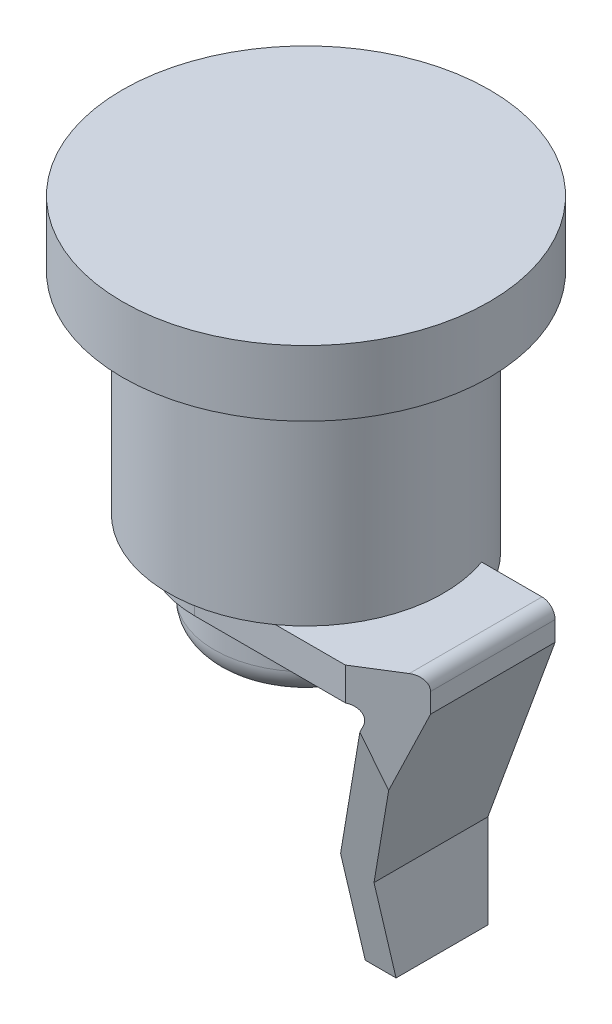
ISO-10303-21;
HEADER;
FILE_DESCRIPTION(('STEP AP214'),'2;1');
FILE_NAME('part.step','',(''),(''),'','','');
FILE_SCHEMA(('AUTOMOTIVE_DESIGN { 1 0 10303 214 1 1 1 1 }'));
ENDSEC;
DATA;
#1=APPLICATION_CONTEXT('core data for automotive mechanical design processes');
#2=APPLICATION_PROTOCOL_DEFINITION('international standard','automotive_design',2000,#1);
#3=PRODUCT_CONTEXT('',#1,'mechanical');
#4=PRODUCT('Part','Part','',(#3));
#5=PRODUCT_RELATED_PRODUCT_CATEGORY('part','',(#4));
#6=PRODUCT_DEFINITION_FORMATION('','',#4);
#7=PRODUCT_DEFINITION_CONTEXT('part definition',#1,'design');
#8=PRODUCT_DEFINITION('design','',#6,#7);
#9=PRODUCT_DEFINITION_SHAPE('','',#8);
#10=(LENGTH_UNIT() NAMED_UNIT(*) SI_UNIT(.MILLI.,.METRE.));
#11=(NAMED_UNIT(*) PLANE_ANGLE_UNIT() SI_UNIT($,.RADIAN.));
#12=(NAMED_UNIT(*) SI_UNIT($,.STERADIAN.) SOLID_ANGLE_UNIT());
#13=UNCERTAINTY_MEASURE_WITH_UNIT(LENGTH_MEASURE(1.E-05),#10,'distance_accuracy_value','');
#14=(GEOMETRIC_REPRESENTATION_CONTEXT(3) GLOBAL_UNCERTAINTY_ASSIGNED_CONTEXT((#13)) GLOBAL_UNIT_ASSIGNED_CONTEXT((#10,
#11,#12)) REPRESENTATION_CONTEXT('',''));
#15=CARTESIAN_POINT('',(0.,0.,0.));
#16=DIRECTION('',(0.,0.,1.));
#17=DIRECTION('',(1.,0.,0.));
#18=AXIS2_PLACEMENT_3D('',#15,#16,#17);
#19=CARTESIAN_POINT('',(8.02046629815024,-31.7403389534745,-31.018779346483));
#20=DIRECTION('',(-0.93969262078591,0.342020143325666,0.));
#21=DIRECTION('',(-0.342020143325666,-0.93969262078591,0.));
#22=AXIS2_PLACEMENT_3D('',#19,#20,#21);
#23=PLANE('',#22);
#24=DIRECTION('',(0.342020143325666,0.93969262078591,0.));
#25=VECTOR('',#24,1.);
#26=CARTESIAN_POINT('',(8.02046629815024,-31.7403389534745,-3.5));
#27=LINE('',#26,#25);
#28=CARTESIAN_POINT('',(8.02046629815024,-31.7403389534745,-3.5));
#29=VERTEX_POINT('',#28);
#30=CARTESIAN_POINT('',(12.351100182854,-19.8420201433257,-3.5));
#31=VERTEX_POINT('',#30);
#32=EDGE_CURVE('E312',#29,#31,#27,.T.);
#33=ORIENTED_EDGE('',*,*,#32,.F.);
#34=DIRECTION('',(0.,0.,1.));
#35=VECTOR('',#34,1.);
#36=CARTESIAN_POINT('',(8.02046629815024,-31.7403389534745,-31.018779346483));
#37=LINE('',#36,#35);
#38=CARTESIAN_POINT('',(8.02046629815024,-31.7403389534745,5.38320911863117));
#39=VERTEX_POINT('',#38);
#40=EDGE_CURVE('E179',#29,#39,#37,.T.);
#41=ORIENTED_EDGE('',*,*,#40,.T.);
#42=DIRECTION('',(0.333947437649457,0.917513044226624,0.215983616418828));
#43=VECTOR('',#42,1.);
#44=CARTESIAN_POINT('',(5.39489369568357,-38.9540403918904,3.6850955776427));
#45=LINE('',#44,#43);
#46=CARTESIAN_POINT('',(12.1812374264969,-20.3087142308233,8.07422660843945));
#47=VERTEX_POINT('',#46);
#48=EDGE_CURVE('E269',#39,#47,#45,.T.);
#49=ORIENTED_EDGE('',*,*,#48,.T.);
#50=DIRECTION('',(-0.334463926731101,-0.918932086315835,0.209039954206938));
#51=VECTOR('',#50,1.);
#52=CARTESIAN_POINT('',(10.9355217045529,-23.7312900479239,8.85279893465442));
#53=LINE('',#52,#51);
#54=CARTESIAN_POINT('',(12.351100182854,-19.8420201433257,7.96806238571625));
#55=VERTEX_POINT('',#54);
#56=EDGE_CURVE('E52',#55,#47,#53,.T.);
#57=ORIENTED_EDGE('',*,*,#56,.F.);
#58=DIRECTION('',(0.,0.,1.));
#59=VECTOR('',#58,1.);
#60=CARTESIAN_POINT('',(12.351100182854,-19.8420201433257,-8.5));
#61=LINE('',#60,#59);
#62=EDGE_CURVE('E232',#55,#31,#61,.F.);
#63=ORIENTED_EDGE('',*,*,#62,.T.);
#64=EDGE_LOOP('',(#33,#41,#49,#57,#63));
#65=FACE_BOUND('',#64,.T.);
#66=ADVANCED_FACE('F37',(#65),#23,.T.);
#67=CARTESIAN_POINT('',(0.,-18.5,0.));
#68=DIRECTION('',(0.,-1.,0.));
#69=DIRECTION('',(0.,0.,-1.));
#70=AXIS2_PLACEMENT_3D('',#67,#68,#69);
#71=PLANE('',#70);
#72=CARTESIAN_POINT('',(0.,-18.5,0.));
#73=DIRECTION('',(0.,-1.,0.));
#74=DIRECTION('',(0.,0.,-1.));
#75=AXIS2_PLACEMENT_3D('',#72,#73,#74);
#76=CIRCLE('',#75,7.);
#77=CARTESIAN_POINT('',(0.,-18.5,-7.));
#78=VERTEX_POINT('',#77);
#79=EDGE_CURVE('E205',#78,#78,#76,.T.);
#80=ORIENTED_EDGE('',*,*,#79,.F.);
#81=EDGE_LOOP('',(#80));
#82=FACE_BOUND('',#81,.T.);
#83=DIRECTION('',(-1.,0.,0.));
#84=VECTOR('',#83,1.);
#85=CARTESIAN_POINT('',(0.,-18.5,-3.5));
#86=LINE('',#85,#84);
#87=CARTESIAN_POINT('',(11.4114075620681,-18.5,-3.5));
#88=VERTEX_POINT('',#87);
#89=CARTESIAN_POINT('',(9.89949493661167,-18.5,-3.5));
#90=VERTEX_POINT('',#89);
#91=EDGE_CURVE('E308',#88,#90,#86,.T.);
#92=ORIENTED_EDGE('',*,*,#91,.F.);
#93=DIRECTION('',(0.,0.,1.));
#94=VECTOR('',#93,1.);
#95=CARTESIAN_POINT('',(11.4114075620681,-18.5,8.5));
#96=LINE('',#95,#94);
#97=CARTESIAN_POINT('',(11.4114075620681,-18.5,8.5));
#98=VERTEX_POINT('',#97);
#99=EDGE_CURVE('E60',#88,#98,#96,.T.);
#100=ORIENTED_EDGE('',*,*,#99,.T.);
#101=DIRECTION('',(1.,0.,0.));
#102=VECTOR('',#101,1.);
#103=CARTESIAN_POINT('',(0.,-18.5,8.5));
#104=LINE('',#103,#102);
#105=CARTESIAN_POINT('',(0.,-18.5,8.5));
#106=VERTEX_POINT('',#105);
#107=EDGE_CURVE('E194',#106,#98,#104,.T.);
#108=ORIENTED_EDGE('',*,*,#107,.F.);
#109=CARTESIAN_POINT('',(0.,-18.5,0.));
#110=DIRECTION('',(0.,-1.,0.));
#111=DIRECTION('',(0.,0.,-1.));
#112=AXIS2_PLACEMENT_3D('',#109,#110,#111);
#113=CIRCLE('',#112,8.5);
#114=CARTESIAN_POINT('',(0.,-18.5,-8.5));
#115=VERTEX_POINT('',#114);
#116=EDGE_CURVE('E202',#106,#115,#113,.T.);
#117=ORIENTED_EDGE('',*,*,#116,.T.);
#118=DIRECTION('',(1.,0.,0.));
#119=VECTOR('',#118,1.);
#120=CARTESIAN_POINT('',(0.,-18.5,-8.5));
#121=LINE('',#120,#119);
#122=CARTESIAN_POINT('',(6.16441400296898,-18.5,-8.5));
#123=VERTEX_POINT('',#122);
#124=EDGE_CURVE('E196',#115,#123,#121,.T.);
#125=ORIENTED_EDGE('',*,*,#124,.T.);
#126=CARTESIAN_POINT('',(0.,-18.5,0.));
#127=DIRECTION('',(0.,-1.,0.));
#128=DIRECTION('',(0.,0.,-1.));
#129=AXIS2_PLACEMENT_3D('',#126,#127,#128);
#130=CIRCLE('',#129,10.5);
#131=EDGE_CURVE('E306',#90,#123,#130,.F.);
#132=ORIENTED_EDGE('',*,*,#131,.F.);
#133=EDGE_LOOP('',(#92,#100,#108,#117,#125,#132));
#134=FACE_BOUND('',#133,.T.);
#135=ADVANCED_FACE('F316',(#82,#134),#71,.T.);
#136=CARTESIAN_POINT('',(-13.800441081207,-2.86718192677043,12.179983193176));
#137=DIRECTION('',(0.,-0.229138042386361,0.973393937484381));
#138=DIRECTION('',(0.,-0.973393937484381,-0.229138042386361));
#139=AXIS2_PLACEMENT_3D('',#136,#137,#138);
#140=PLANE('',#139);
#141=DIRECTION('',(0.344216744782319,-0.913910041579759,-0.215135465488949));
#142=VECTOR('',#141,1.);
#143=CARTESIAN_POINT('',(3.31193737381652,3.2396531940517,13.6175391413647));
#144=LINE('',#143,#142);
#145=CARTESIAN_POINT('',(11.5,-18.5,8.5));
#146=VERTEX_POINT('',#145);
#147=CARTESIAN_POINT('',(11.501532765285,-18.5040695567736,8.4990420216969));
#148=VERTEX_POINT('',#147);
#149=EDGE_CURVE('E45',#146,#148,#144,.T.);
#150=ORIENTED_EDGE('',*,*,#149,.F.);
#151=DIRECTION('',(1.,0.,0.));
#152=VECTOR('',#151,1.);
#153=CARTESIAN_POINT('',(-13.800441081207,-18.5,8.5));
#154=LINE('',#153,#152);
#155=EDGE_CURVE('E169',#98,#146,#154,.T.);
#156=ORIENTED_EDGE('',*,*,#155,.F.);
#157=CARTESIAN_POINT('',(11.4114075620681,-19.5,8.26459886017111));
#158=DIRECTION('',(0.,-0.229138042386361,0.973393937484381));
#159=DIRECTION('',(0.,-0.973393937484381,-0.229138042386361));
#160=AXIS2_PLACEMENT_3D('',#157,#158,#159);
#161=ELLIPSE('',#160,1.02733329384029,1.);
#162=EDGE_CURVE('E241',#98,#148,#161,.F.);
#163=ORIENTED_EDGE('',*,*,#162,.T.);
#164=EDGE_LOOP('',(#150,#156,#163));
#165=FACE_BOUND('',#164,.T.);
#166=ADVANCED_FACE('F261',(#165),#140,.T.);
#167=CARTESIAN_POINT('',(0.,-16.,8.5));
#168=DIRECTION('',(0.,0.,-1.));
#169=DIRECTION('',(-1.,0.,0.));
#170=AXIS2_PLACEMENT_3D('',#167,#168,#169);
#171=PLANE('',#170);
#172=ORIENTED_EDGE('',*,*,#155,.T.);
#173=DIRECTION('',(0.,1.,0.));
#174=VECTOR('',#173,1.);
#175=CARTESIAN_POINT('',(11.5,-36.,8.5));
#176=LINE('',#175,#174);
#177=CARTESIAN_POINT('',(11.5,-16.,8.5));
#178=VERTEX_POINT('',#177);
#179=EDGE_CURVE('E250',#146,#178,#176,.T.);
#180=ORIENTED_EDGE('',*,*,#179,.T.);
#181=DIRECTION('',(1.,0.,0.));
#182=VECTOR('',#181,1.);
#183=CARTESIAN_POINT('',(0.,-16.,8.5));
#184=LINE('',#183,#182);
#185=CARTESIAN_POINT('',(6.16441400296898,-16.,8.5));
#186=VERTEX_POINT('',#185);
#187=EDGE_CURVE('E188',#186,#178,#184,.T.);
#188=ORIENTED_EDGE('',*,*,#187,.F.);
#189=CARTESIAN_POINT('',(0.,-16.,8.5));
#190=VERTEX_POINT('',#189);
#191=EDGE_CURVE('E184',#190,#186,#184,.T.);
#192=ORIENTED_EDGE('',*,*,#191,.F.);
#193=DIRECTION('',(0.,-1.,0.));
#194=VECTOR('',#193,1.);
#195=CARTESIAN_POINT('',(0.,-16.,8.5));
#196=LINE('',#195,#194);
#197=EDGE_CURVE('E191',#190,#106,#196,.T.);
#198=ORIENTED_EDGE('',*,*,#197,.T.);
#199=ORIENTED_EDGE('',*,*,#107,.T.);
#200=EDGE_LOOP('',(#172,#180,#188,#192,#198,#199));
#201=FACE_BOUND('',#200,.T.);
#202=ADVANCED_FACE('F336',(#201),#171,.F.);
#203=CARTESIAN_POINT('',(8.02046629815024,-31.7403389534745,-31.018779346483));
#204=DIRECTION('',(-1.,0.,0.));
#205=DIRECTION('',(0.,-1.,0.));
#206=AXIS2_PLACEMENT_3D('',#203,#204,#205);
#207=PLANE('',#206);
#208=DIRECTION('',(0.,1.,0.));
#209=VECTOR('',#208,1.);
#210=CARTESIAN_POINT('',(8.02046629815024,-31.7403389534745,-3.5));
#211=LINE('',#210,#209);
#212=CARTESIAN_POINT('',(8.02046629815024,-39.7403389534745,-3.5));
#213=VERTEX_POINT('',#212);
#214=EDGE_CURVE('E286',#213,#29,#211,.T.);
#215=ORIENTED_EDGE('',*,*,#214,.F.);
#216=DIRECTION('',(0.,0.,1.));
#217=VECTOR('',#216,1.);
#218=CARTESIAN_POINT('',(8.02046629815025,-39.7403389534745,-31.018779346483));
#219=LINE('',#218,#217);
#220=CARTESIAN_POINT('',(8.02046629815024,-39.7403389534745,3.5));
#221=VERTEX_POINT('',#220);
#222=EDGE_CURVE('E168',#213,#221,#219,.T.);
#223=ORIENTED_EDGE('',*,*,#222,.T.);
#224=DIRECTION('',(0.,-0.973393937484381,-0.229138042386361));
#225=VECTOR('',#224,1.);
#226=CARTESIAN_POINT('',(8.02046629815023,-2.86718192677043,12.179983193176));
#227=LINE('',#226,#225);
#228=EDGE_CURVE('E265',#39,#221,#227,.T.);
#229=ORIENTED_EDGE('',*,*,#228,.F.);
#230=ORIENTED_EDGE('',*,*,#40,.F.);
#231=EDGE_LOOP('',(#215,#223,#229,#230));
#232=FACE_BOUND('',#231,.T.);
#233=ADVANCED_FACE('F284',(#232),#207,.T.);
#234=CARTESIAN_POINT('',(8.02046629815025,-39.7403389534745,-31.018779346483));
#235=DIRECTION('',(0.,-1.,0.));
#236=DIRECTION('',(0.,0.,-1.));
#237=AXIS2_PLACEMENT_3D('',#234,#235,#236);
#238=PLANE('',#237);
#239=DIRECTION('',(0.,0.,1.));
#240=VECTOR('',#239,1.);
#241=CARTESIAN_POINT('',(10.369697850115,-39.7403389534745,-31.018779346483));
#242=LINE('',#241,#240);
#243=CARTESIAN_POINT('',(10.369697850115,-39.7403389534745,-3.5));
#244=VERTEX_POINT('',#243);
#245=CARTESIAN_POINT('',(10.369697850115,-39.7403389534745,3.5));
#246=VERTEX_POINT('',#245);
#247=EDGE_CURVE('E166',#244,#246,#242,.T.);
#248=ORIENTED_EDGE('',*,*,#247,.T.);
#249=DIRECTION('',(1.,0.,0.));
#250=VECTOR('',#249,1.);
#251=CARTESIAN_POINT('',(-13.800441081207,-39.7403389534745,3.5));
#252=LINE('',#251,#250);
#253=EDGE_CURVE('E263',#221,#246,#252,.T.);
#254=ORIENTED_EDGE('',*,*,#253,.F.);
#255=ORIENTED_EDGE('',*,*,#222,.F.);
#256=DIRECTION('',(1.,0.,0.));
#257=VECTOR('',#256,1.);
#258=CARTESIAN_POINT('',(-13.800441081207,-39.7403389534745,-3.5));
#259=LINE('',#258,#257);
#260=EDGE_CURVE('E153',#213,#244,#259,.T.);
#261=ORIENTED_EDGE('',*,*,#260,.T.);
#262=EDGE_LOOP('',(#248,#254,#255,#261));
#263=FACE_BOUND('',#262,.T.);
#264=ADVANCED_FACE('F164',(#263),#238,.T.);
#265=CARTESIAN_POINT('',(10.369697850115,-39.7403389534745,-31.018779346483));
#266=DIRECTION('',(1.,0.,0.));
#267=DIRECTION('',(0.,0.,-1.));
#268=AXIS2_PLACEMENT_3D('',#265,#266,#267);
#269=PLANE('',#268);
#270=ORIENTED_EDGE('',*,*,#247,.F.);
#271=DIRECTION('',(0.,-1.,0.));
#272=VECTOR('',#271,1.);
#273=CARTESIAN_POINT('',(10.369697850115,-39.7403389534745,-3.5));
#274=LINE('',#273,#272);
#275=CARTESIAN_POINT('',(10.369697850115,-32.5953893117886,-3.5));
#276=VERTEX_POINT('',#275);
#277=EDGE_CURVE('E149',#276,#244,#274,.T.);
#278=ORIENTED_EDGE('',*,*,#277,.F.);
#279=DIRECTION('',(0.,0.,1.));
#280=VECTOR('',#279,1.);
#281=CARTESIAN_POINT('',(10.369697850115,-32.5953893117886,-31.018779346483));
#282=LINE('',#281,#280);
#283=CARTESIAN_POINT('',(10.369697850115,-32.5953893117886,5.1819292896729));
#284=VERTEX_POINT('',#283);
#285=EDGE_CURVE('E175',#276,#284,#282,.T.);
#286=ORIENTED_EDGE('',*,*,#285,.T.);
#287=DIRECTION('',(0.,-0.973393937484381,-0.229138042386361));
#288=VECTOR('',#287,1.);
#289=CARTESIAN_POINT('',(10.369697850115,-47.4394620836643,1.68761763947029));
#290=LINE('',#289,#288);
#291=EDGE_CURVE('E174',#284,#246,#290,.T.);
#292=ORIENTED_EDGE('',*,*,#291,.T.);
#293=EDGE_LOOP('',(#270,#278,#286,#292));
#294=FACE_BOUND('',#293,.T.);
#295=ADVANCED_FACE('F172',(#294),#269,.T.);
#296=CARTESIAN_POINT('',(15.5,-18.5,-31.018779346483));
#297=DIRECTION('',(0.93969262078591,-0.342020143325666,0.));
#298=DIRECTION('',(0.342020143325666,0.93969262078591,0.));
#299=AXIS2_PLACEMENT_3D('',#296,#297,#298);
#300=PLANE('',#299);
#301=DIRECTION('',(0.334463926731101,0.918932086315835,-0.209039954206938));
#302=VECTOR('',#301,1.);
#303=CARTESIAN_POINT('',(18.0882169681983,-11.3889323232257,4.38236439487606));
#304=LINE('',#303,#302);
#305=CARTESIAN_POINT('',(13.5342192361663,-23.9009382602313,7.22861297739604));
#306=VERTEX_POINT('',#305);
#307=CARTESIAN_POINT('',(15.5,-18.5,6.));
#308=VERTEX_POINT('',#307);
#309=EDGE_CURVE('E278',#306,#308,#304,.T.);
#310=ORIENTED_EDGE('',*,*,#309,.F.);
#311=DIRECTION('',(-0.333947437649457,-0.917513044226624,-0.215983616418828));
#312=VECTOR('',#311,1.);
#313=CARTESIAN_POINT('',(12.6496220753301,-26.3313489849427,6.65649152254661));
#314=LINE('',#313,#312);
#315=EDGE_CURVE('E272',#306,#284,#314,.T.);
#316=ORIENTED_EDGE('',*,*,#315,.T.);
#317=ORIENTED_EDGE('',*,*,#285,.F.);
#318=DIRECTION('',(-0.342020143325666,-0.93969262078591,0.));
#319=VECTOR('',#318,1.);
#320=CARTESIAN_POINT('',(15.5,-18.5,-3.5));
#321=LINE('',#320,#319);
#322=CARTESIAN_POINT('',(15.5,-18.5,-3.5));
#323=VERTEX_POINT('',#322);
#324=EDGE_CURVE('E156',#323,#276,#321,.T.);
#325=ORIENTED_EDGE('',*,*,#324,.F.);
#326=DIRECTION('',(0.,0.,-1.));
#327=VECTOR('',#326,1.);
#328=CARTESIAN_POINT('',(15.5,-18.5,0.));
#329=LINE('',#328,#327);
#330=EDGE_CURVE('E177',#308,#323,#329,.T.);
#331=ORIENTED_EDGE('',*,*,#330,.F.);
#332=EDGE_LOOP('',(#310,#316,#317,#325,#331));
#333=FACE_BOUND('',#332,.T.);
#334=ADVANCED_FACE('F276',(#333),#300,.T.);
#335=CARTESIAN_POINT('',(11.4114075620681,-19.5,0.));
#336=DIRECTION('',(0.,0.,-1.));
#337=DIRECTION('',(-1.,0.,0.));
#338=AXIS2_PLACEMENT_3D('',#335,#336,#337);
#339=CYLINDRICAL_SURFACE('',#338,1.);
#340=ORIENTED_EDGE('',*,*,#62,.F.);
#341=CARTESIAN_POINT('',(11.4114075620681,-19.5,8.55537027370743));
#342=DIRECTION('',(-0.52999894000318,0.,-0.847998304005088));
#343=DIRECTION('',(0.847998304005088,0.,-0.52999894000318));
#344=AXIS2_PLACEMENT_3D('',#341,#342,#343);
#345=ELLIPSE('',#344,1.17924764150708,1.);
#346=EDGE_CURVE('E248',#55,#148,#345,.F.);
#347=ORIENTED_EDGE('',*,*,#346,.T.);
#348=ORIENTED_EDGE('',*,*,#162,.F.);
#349=ORIENTED_EDGE('',*,*,#99,.F.);
#350=CARTESIAN_POINT('',(11.4114075620681,-19.5,-3.5));
#351=DIRECTION('',(0.,0.,1.));
#352=DIRECTION('',(1.,0.,0.));
#353=AXIS2_PLACEMENT_3D('',#350,#351,#352);
#354=CIRCLE('',#353,1.);
#355=EDGE_CURVE('E310',#88,#31,#354,.F.);
#356=ORIENTED_EDGE('',*,*,#355,.T.);
#357=EDGE_LOOP('',(#340,#347,#348,#349,#356));
#358=FACE_BOUND('',#357,.T.);
#359=ADVANCED_FACE('F257',(#358),#339,.F.);
#360=CARTESIAN_POINT('',(0.,-18.5,0.));
#361=DIRECTION('',(0.,1.,0.));
#362=DIRECTION('',(0.,0.,1.));
#363=AXIS2_PLACEMENT_3D('',#360,#361,#362);
#364=CYLINDRICAL_SURFACE('',#363,8.5);
#365=DIRECTION('',(0.,-1.,0.));
#366=VECTOR('',#365,1.);
#367=CARTESIAN_POINT('',(0.,-16.,-8.5));
#368=LINE('',#367,#366);
#369=CARTESIAN_POINT('',(0.,-16.,-8.5));
#370=VERTEX_POINT('',#369);
#371=EDGE_CURVE('E199',#370,#115,#368,.T.);
#372=ORIENTED_EDGE('',*,*,#371,.T.);
#373=ORIENTED_EDGE('',*,*,#116,.F.);
#374=ORIENTED_EDGE('',*,*,#197,.F.);
#375=CARTESIAN_POINT('',(0.,-16.,0.));
#376=DIRECTION('',(0.,-1.,0.));
#377=DIRECTION('',(0.,0.,-1.));
#378=AXIS2_PLACEMENT_3D('',#375,#376,#377);
#379=CIRCLE('',#378,8.5);
#380=EDGE_CURVE('E209',#190,#370,#379,.T.);
#381=ORIENTED_EDGE('',*,*,#380,.T.);
#382=EDGE_LOOP('',(#372,#373,#374,#381));
#383=FACE_BOUND('',#382,.T.);
#384=ADVANCED_FACE('F351',(#383),#364,.T.);
#385=CARTESIAN_POINT('',(0.,5.,0.));
#386=DIRECTION('',(0.,-1.,0.));
#387=DIRECTION('',(0.,0.,-1.));
#388=AXIS2_PLACEMENT_3D('',#385,#386,#387);
#389=CYLINDRICAL_SURFACE('',#388,14.);
#390=CARTESIAN_POINT('',(0.,5.,0.));
#391=DIRECTION('',(0.,1.,0.));
#392=DIRECTION('',(0.,0.,1.));
#393=AXIS2_PLACEMENT_3D('',#390,#391,#392);
#394=CIRCLE('',#393,14.);
#395=CARTESIAN_POINT('',(0.,5.,14.));
#396=VERTEX_POINT('',#395);
#397=EDGE_CURVE('E221',#396,#396,#394,.T.);
#398=ORIENTED_EDGE('',*,*,#397,.F.);
#399=EDGE_LOOP('',(#398));
#400=FACE_BOUND('',#399,.T.);
#401=CARTESIAN_POINT('',(0.,0.,0.));
#402=DIRECTION('',(0.,1.,0.));
#403=DIRECTION('',(0.,0.,1.));
#404=AXIS2_PLACEMENT_3D('',#401,#402,#403);
#405=CIRCLE('',#404,14.);
#406=CARTESIAN_POINT('',(0.,0.,14.));
#407=VERTEX_POINT('',#406);
#408=EDGE_CURVE('E218',#407,#407,#405,.T.);
#409=ORIENTED_EDGE('',*,*,#408,.T.);
#410=EDGE_LOOP('',(#409));
#411=FACE_BOUND('',#410,.T.);
#412=ADVANCED_FACE('F354',(#400,#411),#389,.T.);
#413=CARTESIAN_POINT('',(0.,5.,0.));
#414=DIRECTION('',(0.,1.,0.));
#415=DIRECTION('',(0.,0.,1.));
#416=AXIS2_PLACEMENT_3D('',#413,#414,#415);
#417=PLANE('',#416);
#418=ORIENTED_EDGE('',*,*,#397,.T.);
#419=EDGE_LOOP('',(#418));
#420=FACE_BOUND('',#419,.T.);
#421=ADVANCED_FACE('F364',(#420),#417,.T.);
#422=CARTESIAN_POINT('',(0.,0.,0.));
#423=DIRECTION('',(0.,1.,0.));
#424=DIRECTION('',(0.,0.,1.));
#425=AXIS2_PLACEMENT_3D('',#422,#423,#424);
#426=PLANE('',#425);
#427=CARTESIAN_POINT('',(0.,0.,0.));
#428=DIRECTION('',(0.,-1.,0.));
#429=DIRECTION('',(0.,0.,-1.));
#430=AXIS2_PLACEMENT_3D('',#427,#428,#429);
#431=CIRCLE('',#430,10.5);
#432=CARTESIAN_POINT('',(0.,0.,-10.5));
#433=VERTEX_POINT('',#432);
#434=EDGE_CURVE('E215',#433,#433,#431,.T.);
#435=ORIENTED_EDGE('',*,*,#434,.F.);
#436=EDGE_LOOP('',(#435));
#437=FACE_BOUND('',#436,.T.);
#438=ORIENTED_EDGE('',*,*,#408,.F.);
#439=EDGE_LOOP('',(#438));
#440=FACE_BOUND('',#439,.T.);
#441=ADVANCED_FACE('F362',(#437,#440),#426,.F.);
#442=CARTESIAN_POINT('',(0.,-16.,0.));
#443=DIRECTION('',(0.,1.,0.));
#444=DIRECTION('',(0.,0.,1.));
#445=AXIS2_PLACEMENT_3D('',#442,#443,#444);
#446=CYLINDRICAL_SURFACE('',#445,10.5);
#447=CARTESIAN_POINT('',(0.,-16.,0.));
#448=DIRECTION('',(0.,-1.,0.));
#449=DIRECTION('',(0.,0.,-1.));
#450=AXIS2_PLACEMENT_3D('',#447,#448,#449);
#451=CIRCLE('',#450,10.5);
#452=CARTESIAN_POINT('',(9.89949493661167,-16.,-3.5));
#453=VERTEX_POINT('',#452);
#454=EDGE_CURVE('E216',#453,#186,#451,.T.);
#455=ORIENTED_EDGE('',*,*,#454,.F.);
#456=DIRECTION('',(0.,1.,0.));
#457=VECTOR('',#456,1.);
#458=CARTESIAN_POINT('',(9.89949493661167,-36.,-3.5));
#459=LINE('',#458,#457);
#460=EDGE_CURVE('E300',#90,#453,#459,.T.);
#461=ORIENTED_EDGE('',*,*,#460,.F.);
#462=ORIENTED_EDGE('',*,*,#131,.T.);
#463=DIRECTION('',(0.,1.,0.));
#464=VECTOR('',#463,1.);
#465=CARTESIAN_POINT('',(6.16441400296898,-36.,-8.5));
#466=LINE('',#465,#464);
#467=CARTESIAN_POINT('',(6.16441400296898,-16.,-8.5));
#468=VERTEX_POINT('',#467);
#469=EDGE_CURVE('E289',#123,#468,#466,.T.);
#470=ORIENTED_EDGE('',*,*,#469,.T.);
#471=EDGE_CURVE('E212',#186,#468,#451,.T.);
#472=ORIENTED_EDGE('',*,*,#471,.F.);
#473=EDGE_LOOP('',(#455,#461,#462,#470,#472));
#474=FACE_BOUND('',#473,.T.);
#475=ORIENTED_EDGE('',*,*,#434,.T.);
#476=EDGE_LOOP('',(#475));
#477=FACE_BOUND('',#476,.T.);
#478=ADVANCED_FACE('F358',(#474,#477),#446,.T.);
#479=CARTESIAN_POINT('',(0.,-16.,0.));
#480=DIRECTION('',(0.,-1.,0.));
#481=DIRECTION('',(0.,0.,-1.));
#482=AXIS2_PLACEMENT_3D('',#479,#480,#481);
#483=PLANE('',#482);
#484=DIRECTION('',(1.,0.,0.));
#485=VECTOR('',#484,1.);
#486=CARTESIAN_POINT('',(0.,-16.,-8.5));
#487=LINE('',#486,#485);
#488=EDGE_CURVE('E187',#370,#468,#487,.T.);
#489=ORIENTED_EDGE('',*,*,#488,.F.);
#490=ORIENTED_EDGE('',*,*,#380,.F.);
#491=ORIENTED_EDGE('',*,*,#191,.T.);
#492=ORIENTED_EDGE('',*,*,#471,.T.);
#493=EDGE_LOOP('',(#489,#490,#491,#492));
#494=FACE_BOUND('',#493,.T.);
#495=ADVANCED_FACE('F348',(#494),#483,.T.);
#496=CARTESIAN_POINT('',(0.,-23.5,0.));
#497=DIRECTION('',(0.,1.,0.));
#498=DIRECTION('',(0.,0.,1.));
#499=AXIS2_PLACEMENT_3D('',#496,#497,#498);
#500=CYLINDRICAL_SURFACE('',#499,7.);
#501=CARTESIAN_POINT('',(0.,-21.5,0.));
#502=DIRECTION('',(0.,-1.,0.));
#503=DIRECTION('',(0.,0.,-1.));
#504=AXIS2_PLACEMENT_3D('',#501,#502,#503);
#505=CIRCLE('',#504,7.);
#506=CARTESIAN_POINT('',(0.,-21.5,-7.));
#507=VERTEX_POINT('',#506);
#508=EDGE_CURVE('E228',#507,#507,#505,.F.);
#509=ORIENTED_EDGE('',*,*,#508,.T.);
#510=EDGE_LOOP('',(#509));
#511=FACE_BOUND('',#510,.T.);
#512=ORIENTED_EDGE('',*,*,#79,.T.);
#513=EDGE_LOOP('',(#512));
#514=FACE_BOUND('',#513,.T.);
#515=ADVANCED_FACE('F345',(#511,#514),#500,.T.);
#516=CARTESIAN_POINT('',(0.,-23.5,0.));
#517=DIRECTION('',(0.,-1.,0.));
#518=DIRECTION('',(0.,0.,-1.));
#519=AXIS2_PLACEMENT_3D('',#516,#517,#518);
#520=PLANE('',#519);
#521=CARTESIAN_POINT('',(0.,-23.5,0.));
#522=DIRECTION('',(0.,-1.,0.));
#523=DIRECTION('',(0.,0.,-1.));
#524=AXIS2_PLACEMENT_3D('',#521,#522,#523);
#525=CIRCLE('',#524,5.);
#526=CARTESIAN_POINT('',(0.,-23.5,-5.));
#527=VERTEX_POINT('',#526);
#528=EDGE_CURVE('E208',#527,#527,#525,.T.);
#529=ORIENTED_EDGE('',*,*,#528,.T.);
#530=EDGE_LOOP('',(#529));
#531=FACE_BOUND('',#530,.T.);
#532=ADVANCED_FACE('F342',(#531),#520,.T.);
#533=CARTESIAN_POINT('',(0.,-21.5,0.));
#534=DIRECTION('',(0.,-1.,0.));
#535=DIRECTION('',(0.,0.,-1.));
#536=AXIS2_PLACEMENT_3D('',#533,#534,#535);
#537=TOROIDAL_SURFACE('',#536,5.,2.);
#538=ORIENTED_EDGE('',*,*,#508,.F.);
#539=EDGE_LOOP('',(#538));
#540=FACE_BOUND('',#539,.T.);
#541=ORIENTED_EDGE('',*,*,#528,.F.);
#542=EDGE_LOOP('',(#541));
#543=FACE_BOUND('',#542,.T.);
#544=ADVANCED_FACE('F330',(#540,#543),#537,.T.);
#545=CARTESIAN_POINT('',(0.,-16.,0.));
#546=DIRECTION('',(0.,-1.,0.));
#547=DIRECTION('',(0.,0.,-1.));
#548=AXIS2_PLACEMENT_3D('',#545,#546,#547);
#549=PLANE('',#548);
#550=ORIENTED_EDGE('',*,*,#187,.T.);
#551=DIRECTION('',(-0.847998304005088,0.,0.52999894000318));
#552=VECTOR('',#551,1.);
#553=CARTESIAN_POINT('',(7.05056179775281,-16.,11.2808988764045));
#554=LINE('',#553,#552);
#555=CARTESIAN_POINT('',(14.5,-16.,6.625));
#556=VERTEX_POINT('',#555);
#557=EDGE_CURVE('E292',#556,#178,#554,.T.);
#558=ORIENTED_EDGE('',*,*,#557,.F.);
#559=DIRECTION('',(0.,0.,-1.));
#560=VECTOR('',#559,1.);
#561=CARTESIAN_POINT('',(14.5,-16.,0.));
#562=LINE('',#561,#560);
#563=CARTESIAN_POINT('',(14.5,-16.,-3.5));
#564=VERTEX_POINT('',#563);
#565=EDGE_CURVE('E235',#556,#564,#562,.T.);
#566=ORIENTED_EDGE('',*,*,#565,.T.);
#567=DIRECTION('',(1.,0.,0.));
#568=VECTOR('',#567,1.);
#569=CARTESIAN_POINT('',(0.,-16.,-3.5));
#570=LINE('',#569,#568);
#571=EDGE_CURVE('E287',#453,#564,#570,.T.);
#572=ORIENTED_EDGE('',*,*,#571,.F.);
#573=ORIENTED_EDGE('',*,*,#454,.T.);
#574=EDGE_LOOP('',(#550,#558,#566,#572,#573));
#575=FACE_BOUND('',#574,.T.);
#576=ADVANCED_FACE('F326',(#575),#549,.F.);
#577=CARTESIAN_POINT('',(15.5,-16.,0.));
#578=DIRECTION('',(-1.,0.,0.));
#579=DIRECTION('',(0.,0.,1.));
#580=AXIS2_PLACEMENT_3D('',#577,#578,#579);
#581=PLANE('',#580);
#582=DIRECTION('',(0.,0.,-1.));
#583=VECTOR('',#582,1.);
#584=CARTESIAN_POINT('',(15.5,-17.,0.));
#585=LINE('',#584,#583);
#586=CARTESIAN_POINT('',(15.5,-17.,-3.5));
#587=VERTEX_POINT('',#586);
#588=CARTESIAN_POINT('',(15.5,-17.,6.00000000000001));
#589=VERTEX_POINT('',#588);
#590=EDGE_CURVE('E238',#587,#589,#585,.F.);
#591=ORIENTED_EDGE('',*,*,#590,.T.);
#592=DIRECTION('',(0.,1.,0.));
#593=VECTOR('',#592,1.);
#594=CARTESIAN_POINT('',(15.5,-36.,6.));
#595=LINE('',#594,#593);
#596=EDGE_CURVE('E294',#308,#589,#595,.T.);
#597=ORIENTED_EDGE('',*,*,#596,.F.);
#598=ORIENTED_EDGE('',*,*,#330,.T.);
#599=DIRECTION('',(0.,1.,0.));
#600=VECTOR('',#599,1.);
#601=CARTESIAN_POINT('',(15.5,-36.,-3.5));
#602=LINE('',#601,#600);
#603=EDGE_CURVE('E295',#323,#587,#602,.T.);
#604=ORIENTED_EDGE('',*,*,#603,.T.);
#605=EDGE_LOOP('',(#591,#597,#598,#604));
#606=FACE_BOUND('',#605,.T.);
#607=ADVANCED_FACE('F329',(#606),#581,.F.);
#608=CARTESIAN_POINT('',(0.,-16.,-8.5));
#609=DIRECTION('',(0.,0.,-1.));
#610=DIRECTION('',(-1.,0.,0.));
#611=AXIS2_PLACEMENT_3D('',#608,#609,#610);
#612=PLANE('',#611);
#613=ORIENTED_EDGE('',*,*,#469,.F.);
#614=ORIENTED_EDGE('',*,*,#124,.F.);
#615=ORIENTED_EDGE('',*,*,#371,.F.);
#616=ORIENTED_EDGE('',*,*,#488,.T.);
#617=EDGE_LOOP('',(#613,#614,#615,#616));
#618=FACE_BOUND('',#617,.T.);
#619=ADVANCED_FACE('F332',(#618),#612,.T.);
#620=CARTESIAN_POINT('',(14.5,-17.,0.));
#621=DIRECTION('',(0.,0.,-1.));
#622=DIRECTION('',(-1.,0.,0.));
#623=AXIS2_PLACEMENT_3D('',#620,#621,#622);
#624=CYLINDRICAL_SURFACE('',#623,1.);
#625=CARTESIAN_POINT('',(14.5,-17.,6.62500000000001));
#626=DIRECTION('',(-0.52999894000318,0.,-0.847998304005088));
#627=DIRECTION('',(0.847998304005088,0.,-0.52999894000318));
#628=AXIS2_PLACEMENT_3D('',#625,#626,#627);
#629=ELLIPSE('',#628,1.17924764150708,1.);
#630=EDGE_CURVE('E259',#589,#556,#629,.F.);
#631=ORIENTED_EDGE('',*,*,#630,.F.);
#632=ORIENTED_EDGE('',*,*,#590,.F.);
#633=CARTESIAN_POINT('',(14.5,-17.,-3.5));
#634=DIRECTION('',(0.,0.,1.));
#635=DIRECTION('',(1.,0.,0.));
#636=AXIS2_PLACEMENT_3D('',#633,#634,#635);
#637=CIRCLE('',#636,1.);
#638=EDGE_CURVE('E11',#564,#587,#637,.F.);
#639=ORIENTED_EDGE('',*,*,#638,.F.);
#640=ORIENTED_EDGE('',*,*,#565,.F.);
#641=EDGE_LOOP('',(#631,#632,#639,#640));
#642=FACE_BOUND('',#641,.T.);
#643=ADVANCED_FACE('F39',(#642),#624,.T.);
#644=EDGE_CURVE('E243',#47,#306,#144,.T.);
#645=ORIENTED_EDGE('',*,*,#644,.F.);
#646=ORIENTED_EDGE('',*,*,#48,.F.);
#647=ORIENTED_EDGE('',*,*,#228,.T.);
#648=ORIENTED_EDGE('',*,*,#253,.T.);
#649=ORIENTED_EDGE('',*,*,#291,.F.);
#650=ORIENTED_EDGE('',*,*,#315,.F.);
#651=EDGE_LOOP('',(#645,#646,#647,#648,#649,#650));
#652=FACE_BOUND('',#651,.T.);
#653=ADVANCED_FACE('F280',(#652),#140,.T.);
#654=CARTESIAN_POINT('',(7.05056179775281,-36.,11.2808988764045));
#655=DIRECTION('',(-0.52999894000318,0.,-0.847998304005088));
#656=DIRECTION('',(-0.847998304005088,0.,0.52999894000318));
#657=AXIS2_PLACEMENT_3D('',#654,#655,#656);
#658=PLANE('',#657);
#659=ORIENTED_EDGE('',*,*,#630,.T.);
#660=ORIENTED_EDGE('',*,*,#557,.T.);
#661=ORIENTED_EDGE('',*,*,#179,.F.);
#662=ORIENTED_EDGE('',*,*,#149,.T.);
#663=ORIENTED_EDGE('',*,*,#346,.F.);
#664=ORIENTED_EDGE('',*,*,#56,.T.);
#665=ORIENTED_EDGE('',*,*,#644,.T.);
#666=ORIENTED_EDGE('',*,*,#309,.T.);
#667=ORIENTED_EDGE('',*,*,#596,.T.);
#668=EDGE_LOOP('',(#659,#660,#661,#662,#663,#664,#665,#666,#667));
#669=FACE_BOUND('',#668,.T.);
#670=ADVANCED_FACE('F247',(#669),#658,.F.);
#671=CARTESIAN_POINT('',(0.,-36.,-3.5));
#672=DIRECTION('',(0.,0.,1.));
#673=DIRECTION('',(1.,0.,0.));
#674=AXIS2_PLACEMENT_3D('',#671,#672,#673);
#675=PLANE('',#674);
#676=ORIENTED_EDGE('',*,*,#214,.T.);
#677=ORIENTED_EDGE('',*,*,#32,.T.);
#678=ORIENTED_EDGE('',*,*,#355,.F.);
#679=ORIENTED_EDGE('',*,*,#91,.T.);
#680=ORIENTED_EDGE('',*,*,#460,.T.);
#681=ORIENTED_EDGE('',*,*,#571,.T.);
#682=ORIENTED_EDGE('',*,*,#638,.T.);
#683=ORIENTED_EDGE('',*,*,#603,.F.);
#684=ORIENTED_EDGE('',*,*,#324,.T.);
#685=ORIENTED_EDGE('',*,*,#277,.T.);
#686=ORIENTED_EDGE('',*,*,#260,.F.);
#687=EDGE_LOOP('',(#676,#677,#678,#679,#680,#681,#682,#683,#684,#685,#686));
#688=FACE_BOUND('',#687,.T.);
#689=ADVANCED_FACE('F152',(#688),#675,.F.);
#690=CLOSED_SHELL('',(#66,#135,#166,#202,#233,#264,#295,#334,#359,#384,#412,#421,#441,#478,#495,
#515,#532,#544,#576,#607,#619,#643,#653,#670,#689));
#691=MANIFOLD_SOLID_BREP('B2',#690);
#692=ADVANCED_BREP_SHAPE_REPRESENTATION('',(#18,#691),#14);
#693=SHAPE_DEFINITION_REPRESENTATION(#9,#692);
ENDSEC;
END-ISO-10303-21;
